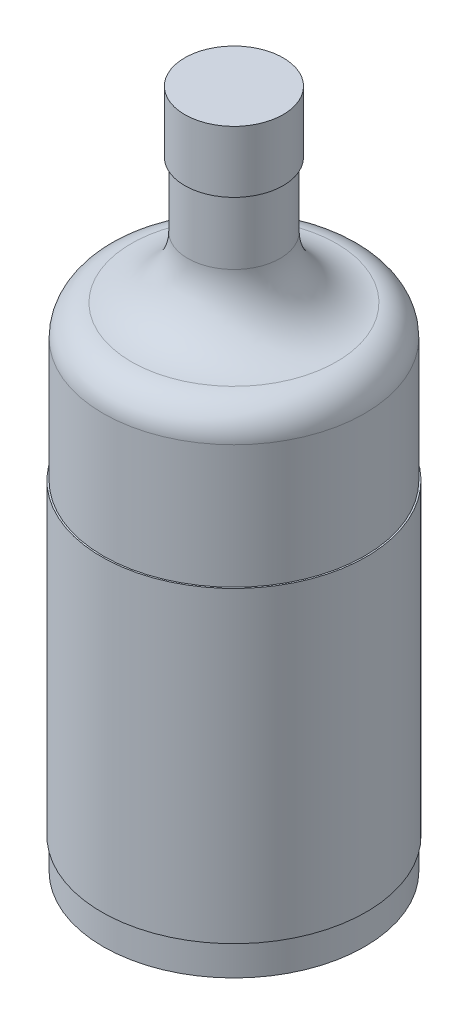
ISO-10303-21;
HEADER;
FILE_DESCRIPTION(('STEP AP214'),'2;1');
FILE_NAME('part.step','',(''),(''),'','','');
FILE_SCHEMA(('AUTOMOTIVE_DESIGN { 1 0 10303 214 1 1 1 1 }'));
ENDSEC;
DATA;
#1=APPLICATION_CONTEXT('core data for automotive mechanical design processes');
#2=APPLICATION_PROTOCOL_DEFINITION('international standard','automotive_design',2000,#1);
#3=PRODUCT_CONTEXT('',#1,'mechanical');
#4=PRODUCT('Part','Part','',(#3));
#5=PRODUCT_RELATED_PRODUCT_CATEGORY('part','',(#4));
#6=PRODUCT_DEFINITION_FORMATION('','',#4);
#7=PRODUCT_DEFINITION_CONTEXT('part definition',#1,'design');
#8=PRODUCT_DEFINITION('design','',#6,#7);
#9=PRODUCT_DEFINITION_SHAPE('','',#8);
#10=(LENGTH_UNIT() NAMED_UNIT(*) SI_UNIT(.MILLI.,.METRE.));
#11=(NAMED_UNIT(*) PLANE_ANGLE_UNIT() SI_UNIT($,.RADIAN.));
#12=(NAMED_UNIT(*) SI_UNIT($,.STERADIAN.) SOLID_ANGLE_UNIT());
#13=UNCERTAINTY_MEASURE_WITH_UNIT(LENGTH_MEASURE(1.E-05),#10,'distance_accuracy_value','');
#14=(GEOMETRIC_REPRESENTATION_CONTEXT(3) GLOBAL_UNCERTAINTY_ASSIGNED_CONTEXT((#13)) GLOBAL_UNIT_ASSIGNED_CONTEXT((#10,
#11,#12)) REPRESENTATION_CONTEXT('',''));
#15=CARTESIAN_POINT('',(0.,0.,0.));
#16=DIRECTION('',(0.,0.,1.));
#17=DIRECTION('',(1.,0.,0.));
#18=AXIS2_PLACEMENT_3D('',#15,#16,#17);
#19=CARTESIAN_POINT('',(0.,160.,0.));
#20=DIRECTION('',(0.,-1.,0.));
#21=DIRECTION('',(0.,0.,-1.));
#22=AXIS2_PLACEMENT_3D('',#19,#20,#21);
#23=CYLINDRICAL_SURFACE('',#22,42.5);
#24=CARTESIAN_POINT('',(0.,150.104348142246,0.));
#25=DIRECTION('',(0.,-1.,0.));
#26=DIRECTION('',(0.,0.,-1.));
#27=AXIS2_PLACEMENT_3D('',#24,#25,#26);
#28=CIRCLE('',#27,42.5);
#29=CARTESIAN_POINT('',(0.,150.104348142246,-42.5));
#30=VERTEX_POINT('',#29);
#31=EDGE_CURVE('E44',#30,#30,#28,.T.);
#32=ORIENTED_EDGE('',*,*,#31,.T.);
#33=EDGE_LOOP('',(#32));
#34=FACE_BOUND('',#33,.T.);
#35=CARTESIAN_POINT('',(0.,110.,0.));
#36=DIRECTION('',(0.,-1.,0.));
#37=DIRECTION('',(0.,0.,-1.));
#38=AXIS2_PLACEMENT_3D('',#35,#36,#37);
#39=CIRCLE('',#38,42.5);
#40=CARTESIAN_POINT('',(0.,110.,-42.5));
#41=VERTEX_POINT('',#40);
#42=EDGE_CURVE('E10',#41,#41,#39,.T.);
#43=ORIENTED_EDGE('',*,*,#42,.F.);
#44=EDGE_LOOP('',(#43));
#45=FACE_BOUND('',#44,.T.);
#46=ADVANCED_FACE('F33',(#34,#45),#23,.T.);
#47=CARTESIAN_POINT('',(0.,220.,0.));
#48=DIRECTION('',(0.,-1.,0.));
#49=DIRECTION('',(0.,0.,-1.));
#50=AXIS2_PLACEMENT_3D('',#47,#48,#49);
#51=CYLINDRICAL_SURFACE('',#50,15.);
#52=CARTESIAN_POINT('',(0.,180.,0.));
#53=DIRECTION('',(0.,1.,0.));
#54=DIRECTION('',(0.,0.,1.));
#55=AXIS2_PLACEMENT_3D('',#52,#53,#54);
#56=CIRCLE('',#55,15.);
#57=CARTESIAN_POINT('',(0.,180.,15.));
#58=VERTEX_POINT('',#57);
#59=EDGE_CURVE('E74',#58,#58,#56,.T.);
#60=ORIENTED_EDGE('',*,*,#59,.T.);
#61=EDGE_LOOP('',(#60));
#62=FACE_BOUND('',#61,.T.);
#63=CARTESIAN_POINT('',(0.,201.,0.));
#64=DIRECTION('',(0.,1.,0.));
#65=DIRECTION('',(0.,0.,1.));
#66=AXIS2_PLACEMENT_3D('',#63,#64,#65);
#67=CIRCLE('',#66,15.);
#68=CARTESIAN_POINT('',(0.,201.,15.));
#69=VERTEX_POINT('',#68);
#70=EDGE_CURVE('E40',#69,#69,#67,.T.);
#71=ORIENTED_EDGE('',*,*,#70,.F.);
#72=EDGE_LOOP('',(#71));
#73=FACE_BOUND('',#72,.T.);
#74=ADVANCED_FACE('F92',(#62,#73),#51,.T.);
#75=CARTESIAN_POINT('',(0.,180.,0.));
#76=DIRECTION('',(0.,1.,0.));
#77=DIRECTION('',(0.,0.,1.));
#78=AXIS2_PLACEMENT_3D('',#75,#76,#77);
#79=TOROIDAL_SURFACE('',#78,35.,20.);
#80=CARTESIAN_POINT('',(0.,160.069565428162,0.));
#81=DIRECTION('',(0.,1.,0.));
#82=DIRECTION('',(0.,0.,1.));
#83=AXIS2_PLACEMENT_3D('',#80,#81,#82);
#84=CIRCLE('',#83,33.3333333333332);
#85=CARTESIAN_POINT('',(0.,160.069565428162,33.3333333333332));
#86=VERTEX_POINT('',#85);
#87=EDGE_CURVE('E49',#86,#86,#84,.T.);
#88=ORIENTED_EDGE('',*,*,#87,.T.);
#89=EDGE_LOOP('',(#88));
#90=FACE_BOUND('',#89,.T.);
#91=ORIENTED_EDGE('',*,*,#59,.F.);
#92=EDGE_LOOP('',(#91));
#93=FACE_BOUND('',#92,.T.);
#94=ADVANCED_FACE('F79',(#90,#93),#79,.F.);
#95=CARTESIAN_POINT('',(0.,150.104348142246,0.));
#96=DIRECTION('',(0.,-1.,0.));
#97=DIRECTION('',(0.,0.,-1.));
#98=AXIS2_PLACEMENT_3D('',#95,#96,#97);
#99=TOROIDAL_SURFACE('',#98,32.5,10.);
#100=ORIENTED_EDGE('',*,*,#31,.F.);
#101=EDGE_LOOP('',(#100));
#102=FACE_BOUND('',#101,.T.);
#103=ORIENTED_EDGE('',*,*,#87,.F.);
#104=EDGE_LOOP('',(#103));
#105=FACE_BOUND('',#104,.T.);
#106=ADVANCED_FACE('F35',(#102,#105),#99,.T.);
#107=CARTESIAN_POINT('',(0.,201.,0.));
#108=DIRECTION('',(0.,1.,0.));
#109=DIRECTION('',(0.,0.,1.));
#110=AXIS2_PLACEMENT_3D('',#107,#108,#109);
#111=CYLINDRICAL_SURFACE('',#110,16.);
#112=CARTESIAN_POINT('',(0.,201.,0.));
#113=DIRECTION('',(0.,1.,0.));
#114=DIRECTION('',(0.,0.,1.));
#115=AXIS2_PLACEMENT_3D('',#112,#113,#114);
#116=CIRCLE('',#115,16.);
#117=CARTESIAN_POINT('',(0.,201.,16.));
#118=VERTEX_POINT('',#117);
#119=EDGE_CURVE('E59',#118,#118,#116,.T.);
#120=ORIENTED_EDGE('',*,*,#119,.T.);
#121=EDGE_LOOP('',(#120));
#122=FACE_BOUND('',#121,.T.);
#123=CARTESIAN_POINT('',(0.,221.,0.));
#124=DIRECTION('',(0.,1.,0.));
#125=DIRECTION('',(0.,0.,1.));
#126=AXIS2_PLACEMENT_3D('',#123,#124,#125);
#127=CIRCLE('',#126,16.);
#128=CARTESIAN_POINT('',(0.,221.,16.));
#129=VERTEX_POINT('',#128);
#130=EDGE_CURVE('E54',#129,#129,#127,.T.);
#131=ORIENTED_EDGE('',*,*,#130,.F.);
#132=EDGE_LOOP('',(#131));
#133=FACE_BOUND('',#132,.T.);
#134=ADVANCED_FACE('F83',(#122,#133),#111,.T.);
#135=CARTESIAN_POINT('',(0.,201.,0.));
#136=DIRECTION('',(0.,1.,0.));
#137=DIRECTION('',(0.,0.,1.));
#138=AXIS2_PLACEMENT_3D('',#135,#136,#137);
#139=PLANE('',#138);
#140=ORIENTED_EDGE('',*,*,#70,.T.);
#141=EDGE_LOOP('',(#140));
#142=FACE_BOUND('',#141,.T.);
#143=ORIENTED_EDGE('',*,*,#119,.F.);
#144=EDGE_LOOP('',(#143));
#145=FACE_BOUND('',#144,.T.);
#146=ADVANCED_FACE('F89',(#142,#145),#139,.F.);
#147=CARTESIAN_POINT('',(0.,221.,0.));
#148=DIRECTION('',(0.,1.,0.));
#149=DIRECTION('',(0.,0.,1.));
#150=AXIS2_PLACEMENT_3D('',#147,#148,#149);
#151=PLANE('',#150);
#152=ORIENTED_EDGE('',*,*,#130,.T.);
#153=EDGE_LOOP('',(#152));
#154=FACE_BOUND('',#153,.T.);
#155=ADVANCED_FACE('F121',(#154),#151,.T.);
#156=CARTESIAN_POINT('',(0.,110.,0.));
#157=DIRECTION('',(0.,-1.,0.));
#158=DIRECTION('',(0.,0.,-1.));
#159=AXIS2_PLACEMENT_3D('',#156,#157,#158);
#160=CYLINDRICAL_SURFACE('',#159,43.);
#161=CARTESIAN_POINT('',(0.,110.,0.));
#162=DIRECTION('',(0.,-1.,0.));
#163=DIRECTION('',(0.,0.,-1.));
#164=AXIS2_PLACEMENT_3D('',#161,#162,#163);
#165=CIRCLE('',#164,43.);
#166=CARTESIAN_POINT('',(0.,110.,-43.));
#167=VERTEX_POINT('',#166);
#168=EDGE_CURVE('E55',#167,#167,#165,.T.);
#169=ORIENTED_EDGE('',*,*,#168,.T.);
#170=EDGE_LOOP('',(#169));
#171=FACE_BOUND('',#170,.T.);
#172=CARTESIAN_POINT('',(0.,10.,0.));
#173=DIRECTION('',(0.,-1.,0.));
#174=DIRECTION('',(0.,0.,-1.));
#175=AXIS2_PLACEMENT_3D('',#172,#173,#174);
#176=CIRCLE('',#175,43.);
#177=CARTESIAN_POINT('',(0.,10.,-43.));
#178=VERTEX_POINT('',#177);
#179=EDGE_CURVE('E62',#178,#178,#176,.T.);
#180=ORIENTED_EDGE('',*,*,#179,.F.);
#181=EDGE_LOOP('',(#180));
#182=FACE_BOUND('',#181,.T.);
#183=ADVANCED_FACE('F124',(#171,#182),#160,.T.);
#184=CARTESIAN_POINT('',(0.,110.,0.));
#185=DIRECTION('',(0.,-1.,0.));
#186=DIRECTION('',(0.,0.,-1.));
#187=AXIS2_PLACEMENT_3D('',#184,#185,#186);
#188=PLANE('',#187);
#189=ORIENTED_EDGE('',*,*,#42,.T.);
#190=EDGE_LOOP('',(#189));
#191=FACE_BOUND('',#190,.T.);
#192=ORIENTED_EDGE('',*,*,#168,.F.);
#193=EDGE_LOOP('',(#192));
#194=FACE_BOUND('',#193,.T.);
#195=ADVANCED_FACE('F117',(#191,#194),#188,.F.);
#196=CARTESIAN_POINT('',(0.,10.,0.));
#197=DIRECTION('',(0.,-1.,0.));
#198=DIRECTION('',(0.,0.,-1.));
#199=AXIS2_PLACEMENT_3D('',#196,#197,#198);
#200=PLANE('',#199);
#201=CARTESIAN_POINT('',(0.,10.,0.));
#202=DIRECTION('',(0.,-1.,0.));
#203=DIRECTION('',(0.,0.,-1.));
#204=AXIS2_PLACEMENT_3D('',#201,#202,#203);
#205=CIRCLE('',#204,42.5);
#206=CARTESIAN_POINT('',(0.,10.,-42.5));
#207=VERTEX_POINT('',#206);
#208=EDGE_CURVE('E52',#207,#207,#205,.T.);
#209=ORIENTED_EDGE('',*,*,#208,.F.);
#210=EDGE_LOOP('',(#209));
#211=FACE_BOUND('',#210,.T.);
#212=ORIENTED_EDGE('',*,*,#179,.T.);
#213=EDGE_LOOP('',(#212));
#214=FACE_BOUND('',#213,.T.);
#215=ADVANCED_FACE('F110',(#211,#214),#200,.T.);
#216=CARTESIAN_POINT('',(0.,0.,0.));
#217=DIRECTION('',(0.,1.,0.));
#218=DIRECTION('',(0.,0.,1.));
#219=AXIS2_PLACEMENT_3D('',#216,#217,#218);
#220=PLANE('',#219);
#221=CARTESIAN_POINT('',(0.,0.,0.));
#222=DIRECTION('',(0.,1.,0.));
#223=DIRECTION('',(0.,0.,1.));
#224=AXIS2_PLACEMENT_3D('',#221,#222,#223);
#225=CIRCLE('',#224,42.5);
#226=CARTESIAN_POINT('',(0.,0.,42.5));
#227=VERTEX_POINT('',#226);
#228=EDGE_CURVE('E70',#227,#227,#225,.T.);
#229=ORIENTED_EDGE('',*,*,#228,.F.);
#230=EDGE_LOOP('',(#229));
#231=FACE_BOUND('',#230,.T.);
#232=ADVANCED_FACE('F106',(#231),#220,.F.);
#233=ORIENTED_EDGE('',*,*,#208,.T.);
#234=EDGE_LOOP('',(#233));
#235=FACE_BOUND('',#234,.T.);
#236=ORIENTED_EDGE('',*,*,#228,.T.);
#237=EDGE_LOOP('',(#236));
#238=FACE_BOUND('',#237,.T.);
#239=ADVANCED_FACE('F97',(#235,#238),#23,.T.);
#240=CLOSED_SHELL('',(#46,#74,#94,#106,#134,#146,#155,#183,#195,#215,#232,#239));
#241=MANIFOLD_SOLID_BREP('B2',#240);
#242=ADVANCED_BREP_SHAPE_REPRESENTATION('',(#18,#241),#14);
#243=SHAPE_DEFINITION_REPRESENTATION(#9,#242);
ENDSEC;
END-ISO-10303-21;
